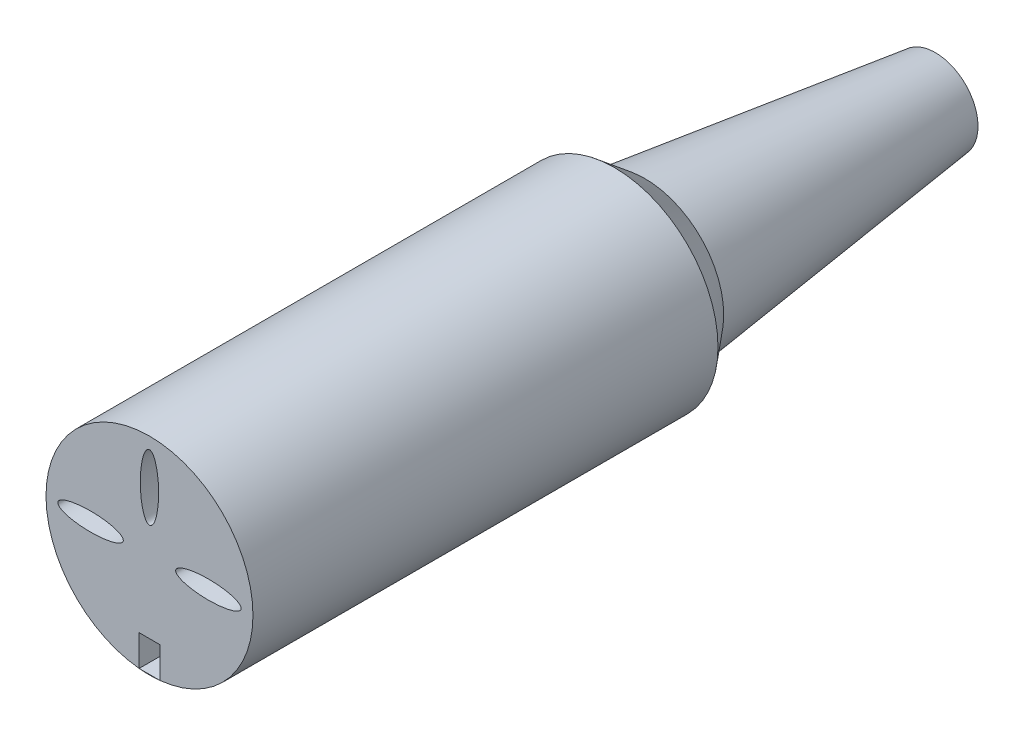
ISO-10303-21;
HEADER;
FILE_DESCRIPTION(('STEP AP214'),'2;1');
FILE_NAME('part.step','',(''),(''),'','','');
FILE_SCHEMA(('AUTOMOTIVE_DESIGN { 1 0 10303 214 1 1 1 1 }'));
ENDSEC;
DATA;
#1=APPLICATION_CONTEXT('core data for automotive mechanical design processes');
#2=APPLICATION_PROTOCOL_DEFINITION('international standard','automotive_design',2000,#1);
#3=PRODUCT_CONTEXT('',#1,'mechanical');
#4=PRODUCT('Part','Part','',(#3));
#5=PRODUCT_RELATED_PRODUCT_CATEGORY('part','',(#4));
#6=PRODUCT_DEFINITION_FORMATION('','',#4);
#7=PRODUCT_DEFINITION_CONTEXT('part definition',#1,'design');
#8=PRODUCT_DEFINITION('design','',#6,#7);
#9=PRODUCT_DEFINITION_SHAPE('','',#8);
#10=(LENGTH_UNIT() NAMED_UNIT(*) SI_UNIT(.MILLI.,.METRE.));
#11=(NAMED_UNIT(*) PLANE_ANGLE_UNIT() SI_UNIT($,.RADIAN.));
#12=(NAMED_UNIT(*) SI_UNIT($,.STERADIAN.) SOLID_ANGLE_UNIT());
#13=UNCERTAINTY_MEASURE_WITH_UNIT(LENGTH_MEASURE(1.E-05),#10,'distance_accuracy_value','');
#14=(GEOMETRIC_REPRESENTATION_CONTEXT(3) GLOBAL_UNCERTAINTY_ASSIGNED_CONTEXT((#13)) GLOBAL_UNIT_ASSIGNED_CONTEXT((#10,
#11,#12)) REPRESENTATION_CONTEXT('',''));
#15=CARTESIAN_POINT('',(0.,0.,0.));
#16=DIRECTION('',(0.,0.,1.));
#17=DIRECTION('',(1.,0.,0.));
#18=AXIS2_PLACEMENT_3D('',#15,#16,#17);
#19=CARTESIAN_POINT('',(7.9,0.,0.));
#20=DIRECTION('',(0.,0.,1.));
#21=DIRECTION('',(1.,0.,0.));
#22=AXIS2_PLACEMENT_3D('',#19,#20,#21);
#23=PLANE('',#22);
#24=DIRECTION('',(0.,1.,0.));
#25=VECTOR('',#24,1.);
#26=CARTESIAN_POINT('',(0.790924608984313,-5.49381771300486,0.));
#27=LINE('',#26,#25);
#28=CARTESIAN_POINT('',(0.790924608984313,-7.8603077715127,0.));
#29=VERTEX_POINT('',#28);
#30=CARTESIAN_POINT('',(0.790924608984313,-5.49381771300486,0.));
#31=VERTEX_POINT('',#30);
#32=EDGE_CURVE('E103',#29,#31,#27,.T.);
#33=ORIENTED_EDGE('',*,*,#32,.F.);
#34=CARTESIAN_POINT('',(0.,0.,0.));
#35=DIRECTION('',(0.,0.,1.));
#36=DIRECTION('',(1.,0.,0.));
#37=AXIS2_PLACEMENT_3D('',#34,#35,#36);
#38=CIRCLE('',#37,7.9);
#39=CARTESIAN_POINT('',(-0.790924608984328,-7.8603077715127,0.));
#40=VERTEX_POINT('',#39);
#41=EDGE_CURVE('E52',#29,#40,#38,.T.);
#42=ORIENTED_EDGE('',*,*,#41,.T.);
#43=DIRECTION('',(0.,-1.,0.));
#44=VECTOR('',#43,1.);
#45=CARTESIAN_POINT('',(-0.790924608984313,-5.49381771300486,0.));
#46=LINE('',#45,#44);
#47=CARTESIAN_POINT('',(-0.790924608984313,-5.49381771300486,0.));
#48=VERTEX_POINT('',#47);
#49=EDGE_CURVE('E124',#48,#40,#46,.T.);
#50=ORIENTED_EDGE('',*,*,#49,.F.);
#51=DIRECTION('',(-1.,0.,0.));
#52=VECTOR('',#51,1.);
#53=CARTESIAN_POINT('',(-0.790924608984313,-5.49381771300486,0.));
#54=LINE('',#53,#52);
#55=EDGE_CURVE('E106',#31,#48,#54,.T.);
#56=ORIENTED_EDGE('',*,*,#55,.F.);
#57=EDGE_LOOP('',(#33,#42,#50,#56));
#58=FACE_BOUND('',#57,.T.);
#59=CARTESIAN_POINT('',(4.5,0.,0.));
#60=DIRECTION('',(0.,0.,1.));
#61=DIRECTION('',(1.,0.,0.));
#62=AXIS2_PLACEMENT_3D('',#59,#60,#61);
#63=ELLIPSE('',#62,2.5,0.7);
#64=CARTESIAN_POINT('',(7.,0.,0.));
#65=VERTEX_POINT('',#64);
#66=EDGE_CURVE('E59',#65,#65,#63,.T.);
#67=ORIENTED_EDGE('',*,*,#66,.F.);
#68=EDGE_LOOP('',(#67));
#69=FACE_BOUND('',#68,.T.);
#70=CARTESIAN_POINT('',(0.,4.5,0.));
#71=DIRECTION('',(0.,0.,1.));
#72=DIRECTION('',(0.,1.,0.));
#73=AXIS2_PLACEMENT_3D('',#70,#71,#72);
#74=ELLIPSE('',#73,2.5,0.7);
#75=CARTESIAN_POINT('',(0.,7.,0.));
#76=VERTEX_POINT('',#75);
#77=EDGE_CURVE('E222',#76,#76,#74,.T.);
#78=ORIENTED_EDGE('',*,*,#77,.F.);
#79=EDGE_LOOP('',(#78));
#80=FACE_BOUND('',#79,.T.);
#81=CARTESIAN_POINT('',(-4.5,0.,0.));
#82=DIRECTION('',(0.,0.,1.));
#83=DIRECTION('',(-1.,0.,0.));
#84=AXIS2_PLACEMENT_3D('',#81,#82,#83);
#85=ELLIPSE('',#84,2.5,0.7);
#86=CARTESIAN_POINT('',(-7.,0.,0.));
#87=VERTEX_POINT('',#86);
#88=EDGE_CURVE('E225',#87,#87,#85,.T.);
#89=ORIENTED_EDGE('',*,*,#88,.F.);
#90=EDGE_LOOP('',(#89));
#91=FACE_BOUND('',#90,.T.);
#92=ADVANCED_FACE('F49',(#58,#69,#80,#91),#23,.T.);
#93=CARTESIAN_POINT('',(0.,0.,-60.));
#94=DIRECTION('',(0.,0.,-1.));
#95=DIRECTION('',(-1.,0.,0.));
#96=AXIS2_PLACEMENT_3D('',#93,#94,#95);
#97=PLANE('',#96);
#98=CARTESIAN_POINT('',(0.,0.,-60.));
#99=DIRECTION('',(0.,0.,1.));
#100=DIRECTION('',(1.,0.,0.));
#101=AXIS2_PLACEMENT_3D('',#98,#99,#100);
#102=CIRCLE('',#101,3.25);
#103=CARTESIAN_POINT('',(3.25,0.,-60.));
#104=VERTEX_POINT('',#103);
#105=EDGE_CURVE('E167',#104,#104,#102,.T.);
#106=ORIENTED_EDGE('',*,*,#105,.F.);
#107=EDGE_LOOP('',(#106));
#108=FACE_BOUND('',#107,.T.);
#109=ADVANCED_FACE('F206',(#108),#97,.T.);
#110=CARTESIAN_POINT('',(0.,0.,-37.8285029198376));
#111=DIRECTION('',(0.,0.,1.));
#112=DIRECTION('',(1.,0.,0.));
#113=AXIS2_PLACEMENT_3D('',#110,#111,#112);
#114=CONICAL_SURFACE('',#113,6.00842019668536,0.123776882818223);
#115=ORIENTED_EDGE('',*,*,#105,.T.);
#116=EDGE_LOOP('',(#115));
#117=FACE_BOUND('',#116,.T.);
#118=CARTESIAN_POINT('',(0.,0.,-37.8285029198376));
#119=DIRECTION('',(0.,0.,1.));
#120=DIRECTION('',(1.,0.,0.));
#121=AXIS2_PLACEMENT_3D('',#118,#119,#120);
#122=CIRCLE('',#121,6.00842019668536);
#123=CARTESIAN_POINT('',(6.00842019668536,0.,-37.8285029198376));
#124=VERTEX_POINT('',#123);
#125=EDGE_CURVE('E136',#124,#124,#122,.T.);
#126=ORIENTED_EDGE('',*,*,#125,.F.);
#127=EDGE_LOOP('',(#126));
#128=FACE_BOUND('',#127,.T.);
#129=ADVANCED_FACE('F211',(#117,#128),#114,.T.);
#130=CARTESIAN_POINT('',(0.,0.,-35.5));
#131=DIRECTION('',(0.,0.,1.));
#132=DIRECTION('',(1.,0.,0.));
#133=AXIS2_PLACEMENT_3D('',#130,#131,#132);
#134=CONICAL_SURFACE('',#133,7.9,0.682231487851029);
#135=ORIENTED_EDGE('',*,*,#125,.T.);
#136=EDGE_LOOP('',(#135));
#137=FACE_BOUND('',#136,.T.);
#138=CARTESIAN_POINT('',(0.,0.,-35.5));
#139=DIRECTION('',(0.,0.,1.));
#140=DIRECTION('',(1.,0.,0.));
#141=AXIS2_PLACEMENT_3D('',#138,#139,#140);
#142=CIRCLE('',#141,7.9);
#143=CARTESIAN_POINT('',(7.9,0.,-35.5));
#144=VERTEX_POINT('',#143);
#145=EDGE_CURVE('E135',#144,#144,#142,.T.);
#146=ORIENTED_EDGE('',*,*,#145,.F.);
#147=EDGE_LOOP('',(#146));
#148=FACE_BOUND('',#147,.T.);
#149=ADVANCED_FACE('F155',(#137,#148),#134,.T.);
#150=CARTESIAN_POINT('',(0.,0.,0.));
#151=DIRECTION('',(0.,0.,1.));
#152=DIRECTION('',(1.,0.,0.));
#153=AXIS2_PLACEMENT_3D('',#150,#151,#152);
#154=CYLINDRICAL_SURFACE('',#153,7.9);
#155=CARTESIAN_POINT('',(-0.790924608984313,-7.8603077715127,-7.));
#156=DIRECTION('',(1.,0.,0.));
#157=VECTOR('',#156,1.);
#158=LINE('',#155,#157);
#159=CARTESIAN_POINT('',(-0.790924608984313,-7.8603077715127,-7.));
#160=VERTEX_POINT('',#159);
#161=CARTESIAN_POINT('',(0.790924608984313,-7.8603077715127,-7.));
#162=VERTEX_POINT('',#161);
#163=EDGE_CURVE('E68',#160,#162,#158,.T.);
#164=ORIENTED_EDGE('',*,*,#163,.F.);
#165=DIRECTION('',(0.,0.,1.));
#166=VECTOR('',#165,1.);
#167=CARTESIAN_POINT('',(-0.790924608984313,-7.8603077715127,-7.));
#168=LINE('',#167,#166);
#169=EDGE_CURVE('E131',#160,#40,#168,.T.);
#170=ORIENTED_EDGE('',*,*,#169,.T.);
#171=ORIENTED_EDGE('',*,*,#41,.F.);
#172=DIRECTION('',(0.,0.,1.));
#173=VECTOR('',#172,1.);
#174=CARTESIAN_POINT('',(0.790924608984313,-7.8603077715127,-7.));
#175=LINE('',#174,#173);
#176=EDGE_CURVE('E96',#162,#29,#175,.T.);
#177=ORIENTED_EDGE('',*,*,#176,.F.);
#178=EDGE_LOOP('',(#164,#170,#171,#177));
#179=FACE_BOUND('',#178,.T.);
#180=ORIENTED_EDGE('',*,*,#145,.T.);
#181=EDGE_LOOP('',(#180));
#182=FACE_BOUND('',#181,.T.);
#183=ADVANCED_FACE('F152',(#179,#182),#154,.T.);
#184=CARTESIAN_POINT('',(0.790924608984313,-5.49381771300486,-7.));
#185=DIRECTION('',(1.,0.,0.));
#186=DIRECTION('',(0.,1.,0.));
#187=AXIS2_PLACEMENT_3D('',#184,#185,#186);
#188=PLANE('',#187);
#189=ORIENTED_EDGE('',*,*,#32,.T.);
#190=DIRECTION('',(0.,0.,1.));
#191=VECTOR('',#190,1.);
#192=CARTESIAN_POINT('',(0.790924608984313,-5.49381771300486,-7.));
#193=LINE('',#192,#191);
#194=CARTESIAN_POINT('',(0.790924608984313,-5.49381771300486,-7.));
#195=VERTEX_POINT('',#194);
#196=EDGE_CURVE('E99',#195,#31,#193,.T.);
#197=ORIENTED_EDGE('',*,*,#196,.F.);
#198=DIRECTION('',(0.,1.,0.));
#199=VECTOR('',#198,1.);
#200=CARTESIAN_POINT('',(0.790924608984313,-5.49381771300486,-7.));
#201=LINE('',#200,#199);
#202=EDGE_CURVE('E101',#162,#195,#201,.T.);
#203=ORIENTED_EDGE('',*,*,#202,.F.);
#204=ORIENTED_EDGE('',*,*,#176,.T.);
#205=EDGE_LOOP('',(#189,#197,#203,#204));
#206=FACE_BOUND('',#205,.T.);
#207=ADVANCED_FACE('F100',(#206),#188,.F.);
#208=CARTESIAN_POINT('',(-0.790924608984313,-5.49381771300486,-7.));
#209=DIRECTION('',(-1.,0.,0.));
#210=DIRECTION('',(0.,0.,1.));
#211=AXIS2_PLACEMENT_3D('',#208,#209,#210);
#212=PLANE('',#211);
#213=ORIENTED_EDGE('',*,*,#49,.T.);
#214=ORIENTED_EDGE('',*,*,#169,.F.);
#215=DIRECTION('',(0.,-1.,0.));
#216=VECTOR('',#215,1.);
#217=CARTESIAN_POINT('',(-0.790924608984313,-5.49381771300486,-7.));
#218=LINE('',#217,#216);
#219=CARTESIAN_POINT('',(-0.790924608984313,-5.49381771300486,-7.));
#220=VERTEX_POINT('',#219);
#221=EDGE_CURVE('E112',#220,#160,#218,.T.);
#222=ORIENTED_EDGE('',*,*,#221,.F.);
#223=DIRECTION('',(0.,0.,1.));
#224=VECTOR('',#223,1.);
#225=CARTESIAN_POINT('',(-0.790924608984313,-5.49381771300486,-7.));
#226=LINE('',#225,#224);
#227=EDGE_CURVE('E85',#220,#48,#226,.T.);
#228=ORIENTED_EDGE('',*,*,#227,.T.);
#229=EDGE_LOOP('',(#213,#214,#222,#228));
#230=FACE_BOUND('',#229,.T.);
#231=ADVANCED_FACE('F150',(#230),#212,.F.);
#232=CARTESIAN_POINT('',(-0.790924608984313,-5.49381771300486,-7.));
#233=DIRECTION('',(0.,1.,0.));
#234=DIRECTION('',(0.,0.,1.));
#235=AXIS2_PLACEMENT_3D('',#232,#233,#234);
#236=PLANE('',#235);
#237=ORIENTED_EDGE('',*,*,#55,.T.);
#238=ORIENTED_EDGE('',*,*,#227,.F.);
#239=DIRECTION('',(-1.,0.,0.));
#240=VECTOR('',#239,1.);
#241=CARTESIAN_POINT('',(-0.790924608984313,-5.49381771300486,-7.));
#242=LINE('',#241,#240);
#243=EDGE_CURVE('E109',#195,#220,#242,.T.);
#244=ORIENTED_EDGE('',*,*,#243,.F.);
#245=ORIENTED_EDGE('',*,*,#196,.T.);
#246=EDGE_LOOP('',(#237,#238,#244,#245));
#247=FACE_BOUND('',#246,.T.);
#248=ADVANCED_FACE('F110',(#247),#236,.F.);
#249=CARTESIAN_POINT('',(0.,0.,-7.));
#250=DIRECTION('',(0.,0.,1.));
#251=DIRECTION('',(1.,0.,0.));
#252=AXIS2_PLACEMENT_3D('',#249,#250,#251);
#253=PLANE('',#252);
#254=ORIENTED_EDGE('',*,*,#202,.T.);
#255=ORIENTED_EDGE('',*,*,#243,.T.);
#256=ORIENTED_EDGE('',*,*,#221,.T.);
#257=ORIENTED_EDGE('',*,*,#163,.T.);
#258=EDGE_LOOP('',(#254,#255,#256,#257));
#259=FACE_BOUND('',#258,.T.);
#260=ADVANCED_FACE('F113',(#259),#253,.T.);
#261=CARTESIAN_POINT('',(-4.5,0.,-7.));
#262=DIRECTION('',(0.,0.,1.));
#263=DIRECTION('',(-1.,0.,0.));
#264=AXIS2_PLACEMENT_3D('',#261,#262,#263);
#265=ELLIPSE('',#264,2.5,0.7);
#266=DIRECTION('',(0.,0.,1.));
#267=VECTOR('',#266,1.);
#268=SURFACE_OF_LINEAR_EXTRUSION('',#265,#267);
#269=CARTESIAN_POINT('',(-7.,0.,-7.));
#270=VERTEX_POINT('',#269);
#271=EDGE_CURVE('E228',#270,#270,#265,.T.);
#272=ORIENTED_EDGE('',*,*,#271,.F.);
#273=EDGE_LOOP('',(#272));
#274=FACE_BOUND('',#273,.T.);
#275=ORIENTED_EDGE('',*,*,#88,.T.);
#276=EDGE_LOOP('',(#275));
#277=FACE_BOUND('',#276,.T.);
#278=ADVANCED_FACE('F149',(#274,#277),#268,.F.);
#279=CARTESIAN_POINT('',(-4.5,0.,-7.));
#280=DIRECTION('',(0.,0.,1.));
#281=DIRECTION('',(1.,0.,0.));
#282=AXIS2_PLACEMENT_3D('',#279,#280,#281);
#283=PLANE('',#282);
#284=ORIENTED_EDGE('',*,*,#271,.T.);
#285=EDGE_LOOP('',(#284));
#286=FACE_BOUND('',#285,.T.);
#287=ADVANCED_FACE('F239',(#286),#283,.T.);
#288=CARTESIAN_POINT('',(0.,4.5,-7.));
#289=DIRECTION('',(0.,0.,1.));
#290=DIRECTION('',(0.,1.,0.));
#291=AXIS2_PLACEMENT_3D('',#288,#289,#290);
#292=ELLIPSE('',#291,2.5,0.7);
#293=DIRECTION('',(0.,0.,1.));
#294=VECTOR('',#293,1.);
#295=SURFACE_OF_LINEAR_EXTRUSION('',#292,#294);
#296=CARTESIAN_POINT('',(0.,7.,-7.));
#297=VERTEX_POINT('',#296);
#298=EDGE_CURVE('E247',#297,#297,#292,.T.);
#299=ORIENTED_EDGE('',*,*,#298,.F.);
#300=EDGE_LOOP('',(#299));
#301=FACE_BOUND('',#300,.T.);
#302=ORIENTED_EDGE('',*,*,#77,.T.);
#303=EDGE_LOOP('',(#302));
#304=FACE_BOUND('',#303,.T.);
#305=ADVANCED_FACE('F243',(#301,#304),#295,.F.);
#306=CARTESIAN_POINT('',(0.,4.5,-7.));
#307=DIRECTION('',(0.,0.,1.));
#308=DIRECTION('',(1.,0.,0.));
#309=AXIS2_PLACEMENT_3D('',#306,#307,#308);
#310=PLANE('',#309);
#311=ORIENTED_EDGE('',*,*,#298,.T.);
#312=EDGE_LOOP('',(#311));
#313=FACE_BOUND('',#312,.T.);
#314=ADVANCED_FACE('F194',(#313),#310,.T.);
#315=CARTESIAN_POINT('',(4.5,0.,-7.));
#316=DIRECTION('',(0.,0.,1.));
#317=DIRECTION('',(1.,0.,0.));
#318=AXIS2_PLACEMENT_3D('',#315,#316,#317);
#319=ELLIPSE('',#318,2.5,0.7);
#320=DIRECTION('',(0.,0.,1.));
#321=VECTOR('',#320,1.);
#322=SURFACE_OF_LINEAR_EXTRUSION('',#319,#321);
#323=CARTESIAN_POINT('',(7.,0.,-7.));
#324=VERTEX_POINT('',#323);
#325=EDGE_CURVE('E12',#324,#324,#319,.T.);
#326=ORIENTED_EDGE('',*,*,#325,.F.);
#327=EDGE_LOOP('',(#326));
#328=FACE_BOUND('',#327,.T.);
#329=ORIENTED_EDGE('',*,*,#66,.T.);
#330=EDGE_LOOP('',(#329));
#331=FACE_BOUND('',#330,.T.);
#332=ADVANCED_FACE('F189',(#328,#331),#322,.F.);
#333=CARTESIAN_POINT('',(4.5,0.,-7.));
#334=DIRECTION('',(0.,0.,1.));
#335=DIRECTION('',(1.,0.,0.));
#336=AXIS2_PLACEMENT_3D('',#333,#334,#335);
#337=PLANE('',#336);
#338=ORIENTED_EDGE('',*,*,#325,.T.);
#339=EDGE_LOOP('',(#338));
#340=FACE_BOUND('',#339,.T.);
#341=ADVANCED_FACE('F193',(#340),#337,.T.);
#342=CLOSED_SHELL('',(#92,#109,#129,#149,#183,#207,#231,#248,#260,#278,#287,#305,#314,#332,#341));
#343=MANIFOLD_SOLID_BREP('B2',#342);
#344=CARTESIAN_POINT('',(0.,0.,0.));
#345=DIRECTION('',(0.,0.,1.));
#346=DIRECTION('',(1.,0.,0.));
#347=AXIS2_PLACEMENT_3D('',#344,#345,#346);
#348=CYLINDRICAL_SURFACE('',#347,7.9);
#349=DIRECTION('',(0.,0.,1.));
#350=VECTOR('',#349,1.);
#351=CARTESIAN_POINT('',(-0.790924608984313,-7.8603077715127,0.));
#352=LINE('',#351,#350);
#353=CARTESIAN_POINT('',(-0.790924608984313,-7.8603077715127,0.));
#354=VERTEX_POINT('',#353);
#355=CARTESIAN_POINT('',(-0.790924608984313,-7.8603077715127,-7.));
#356=VERTEX_POINT('',#355);
#357=EDGE_CURVE('E378',#354,#356,#352,.F.);
#358=ORIENTED_EDGE('',*,*,#357,.T.);
#359=CARTESIAN_POINT('',(0.,0.,-7.));
#360=DIRECTION('',(0.,0.,1.));
#361=DIRECTION('',(-0.100117039111938,-0.994975667280089,0.));
#362=AXIS2_PLACEMENT_3D('',#359,#360,#361);
#363=CIRCLE('',#362,7.9);
#364=CARTESIAN_POINT('',(0.790924608984313,-7.8603077715127,-7.));
#365=VERTEX_POINT('',#364);
#366=EDGE_CURVE('E368',#356,#365,#363,.T.);
#367=ORIENTED_EDGE('',*,*,#366,.T.);
#368=DIRECTION('',(0.,0.,1.));
#369=VECTOR('',#368,1.);
#370=CARTESIAN_POINT('',(0.790924608984328,-7.8603077715127,0.));
#371=LINE('',#370,#369);
#372=CARTESIAN_POINT('',(0.790924608984313,-7.8603077715127,0.));
#373=VERTEX_POINT('',#372);
#374=EDGE_CURVE('E47',#373,#365,#371,.F.);
#375=ORIENTED_EDGE('',*,*,#374,.F.);
#376=CARTESIAN_POINT('',(0.,0.,0.));
#377=DIRECTION('',(0.,0.,1.));
#378=DIRECTION('',(1.,0.,0.));
#379=AXIS2_PLACEMENT_3D('',#376,#377,#378);
#380=CIRCLE('',#379,7.9);
#381=EDGE_CURVE('E388',#354,#373,#380,.T.);
#382=ORIENTED_EDGE('',*,*,#381,.F.);
#383=EDGE_LOOP('',(#358,#367,#375,#382));
#384=FACE_BOUND('',#383,.T.);
#385=ADVANCED_FACE('F359',(#384),#348,.T.);
#386=CARTESIAN_POINT('',(7.9,0.,0.));
#387=DIRECTION('',(0.,0.,1.));
#388=DIRECTION('',(1.,0.,0.));
#389=AXIS2_PLACEMENT_3D('',#386,#387,#388);
#390=PLANE('',#389);
#391=DIRECTION('',(1.,0.,0.));
#392=VECTOR('',#391,1.);
#393=CARTESIAN_POINT('',(-0.790924608984313,-7.8603077715127,0.));
#394=LINE('',#393,#392);
#395=EDGE_CURVE('E384',#354,#373,#394,.T.);
#396=ORIENTED_EDGE('',*,*,#395,.F.);
#397=ORIENTED_EDGE('',*,*,#381,.T.);
#398=EDGE_LOOP('',(#396,#397));
#399=FACE_BOUND('',#398,.T.);
#400=ADVANCED_FACE('F361',(#399),#390,.T.);
#401=CARTESIAN_POINT('',(-0.790924608984313,-7.8603077715127,-7.));
#402=DIRECTION('',(0.,-1.,0.));
#403=DIRECTION('',(0.,0.,-1.));
#404=AXIS2_PLACEMENT_3D('',#401,#402,#403);
#405=PLANE('',#404);
#406=ORIENTED_EDGE('',*,*,#395,.T.);
#407=ORIENTED_EDGE('',*,*,#374,.T.);
#408=ORIENTED_EDGE('',*,*,#366,.F.);
#409=ORIENTED_EDGE('',*,*,#357,.F.);
#410=EDGE_LOOP('',(#406,#407,#408,#409));
#411=FACE_BOUND('',#410,.T.);
#412=ADVANCED_FACE('F385',(#411),#405,.F.);
#413=CLOSED_SHELL('',(#385,#400,#412));
#414=MANIFOLD_SOLID_BREP('B6',#413);
#415=ADVANCED_BREP_SHAPE_REPRESENTATION('',(#18,#343,#414),#14);
#416=SHAPE_DEFINITION_REPRESENTATION(#9,#415);
ENDSEC;
END-ISO-10303-21;
